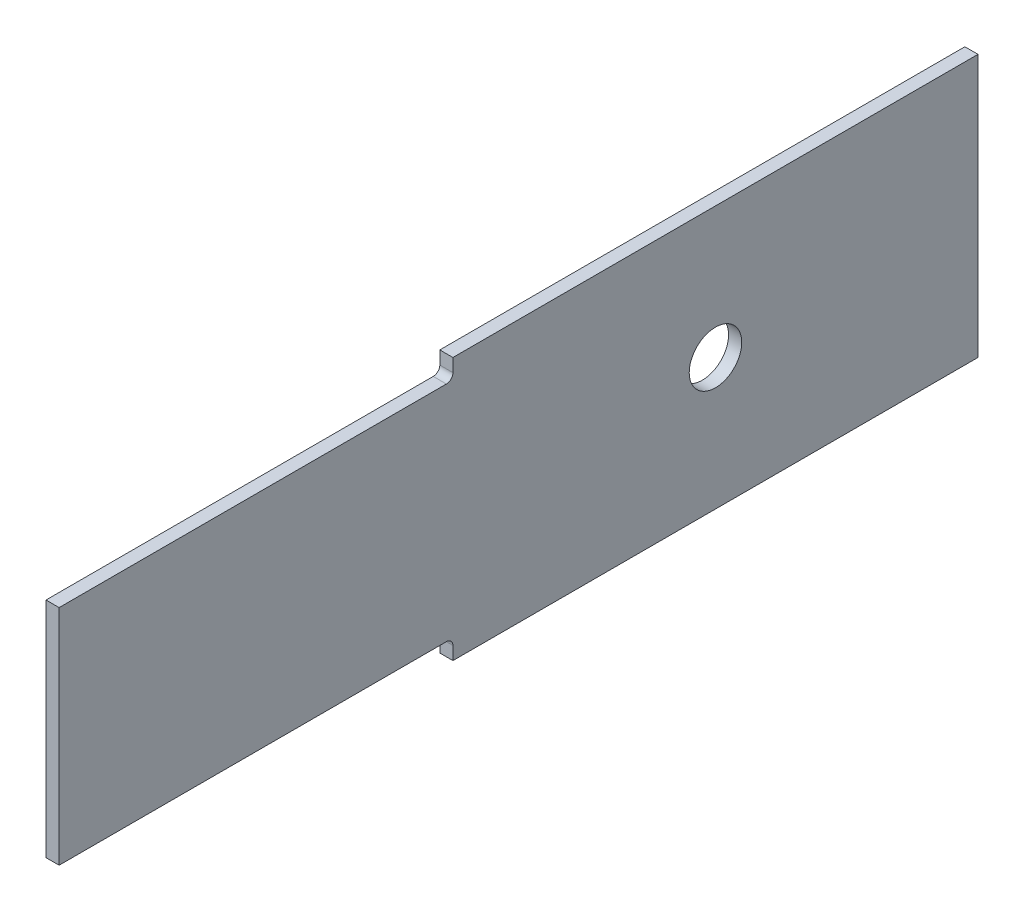
ISO-10303-21;
HEADER;
FILE_DESCRIPTION(('STEP AP214'),'2;1');
FILE_NAME('part.step','',(''),(''),'','','');
FILE_SCHEMA(('AUTOMOTIVE_DESIGN { 1 0 10303 214 1 1 1 1 }'));
ENDSEC;
DATA;
#1=APPLICATION_CONTEXT('core data for automotive mechanical design processes');
#2=APPLICATION_PROTOCOL_DEFINITION('international standard','automotive_design',2000,#1);
#3=PRODUCT_CONTEXT('',#1,'mechanical');
#4=PRODUCT('Part','Part','',(#3));
#5=PRODUCT_RELATED_PRODUCT_CATEGORY('part','',(#4));
#6=PRODUCT_DEFINITION_FORMATION('','',#4);
#7=PRODUCT_DEFINITION_CONTEXT('part definition',#1,'design');
#8=PRODUCT_DEFINITION('design','',#6,#7);
#9=PRODUCT_DEFINITION_SHAPE('','',#8);
#10=(LENGTH_UNIT() NAMED_UNIT(*) SI_UNIT(.MILLI.,.METRE.));
#11=(NAMED_UNIT(*) PLANE_ANGLE_UNIT() SI_UNIT($,.RADIAN.));
#12=(NAMED_UNIT(*) SI_UNIT($,.STERADIAN.) SOLID_ANGLE_UNIT());
#13=UNCERTAINTY_MEASURE_WITH_UNIT(LENGTH_MEASURE(1.E-05),#10,'distance_accuracy_value','');
#14=(GEOMETRIC_REPRESENTATION_CONTEXT(3) GLOBAL_UNCERTAINTY_ASSIGNED_CONTEXT((#13)) GLOBAL_UNIT_ASSIGNED_CONTEXT((#10,
#11,#12)) REPRESENTATION_CONTEXT('',''));
#15=CARTESIAN_POINT('',(0.,0.,0.));
#16=DIRECTION('',(0.,0.,1.));
#17=DIRECTION('',(1.,0.,0.));
#18=AXIS2_PLACEMENT_3D('',#15,#16,#17);
#19=CARTESIAN_POINT('',(0.,0.,80.));
#20=DIRECTION('',(0.,0.,-1.));
#21=DIRECTION('',(-1.,0.,0.));
#22=AXIS2_PLACEMENT_3D('',#19,#20,#21);
#23=PLANE('',#22);
#24=DIRECTION('',(0.,1.,0.));
#25=VECTOR('',#24,1.);
#26=CARTESIAN_POINT('',(1.,-20.,80.));
#27=LINE('',#26,#25);
#28=CARTESIAN_POINT('',(1.,-20.,80.));
#29=VERTEX_POINT('',#28);
#30=CARTESIAN_POINT('',(1.,-18.,80.));
#31=VERTEX_POINT('',#30);
#32=EDGE_CURVE('E150',#29,#31,#27,.T.);
#33=ORIENTED_EDGE('',*,*,#32,.T.);
#34=DIRECTION('',(1.,0.,0.));
#35=VECTOR('',#34,1.);
#36=CARTESIAN_POINT('',(-1.,-18.,80.));
#37=LINE('',#36,#35);
#38=CARTESIAN_POINT('',(-1.,-18.,80.));
#39=VERTEX_POINT('',#38);
#40=EDGE_CURVE('E181',#31,#39,#37,.F.);
#41=ORIENTED_EDGE('',*,*,#40,.T.);
#42=DIRECTION('',(0.,-1.,0.));
#43=VECTOR('',#42,1.);
#44=CARTESIAN_POINT('',(-1.,-20.,80.));
#45=LINE('',#44,#43);
#46=CARTESIAN_POINT('',(-1.,-20.,80.));
#47=VERTEX_POINT('',#46);
#48=EDGE_CURVE('E156',#39,#47,#45,.T.);
#49=ORIENTED_EDGE('',*,*,#48,.T.);
#50=DIRECTION('',(1.,0.,0.));
#51=VECTOR('',#50,1.);
#52=CARTESIAN_POINT('',(-1.,-20.,80.));
#53=LINE('',#52,#51);
#54=EDGE_CURVE('E159',#47,#29,#53,.T.);
#55=ORIENTED_EDGE('',*,*,#54,.T.);
#56=EDGE_LOOP('',(#33,#41,#49,#55));
#57=FACE_BOUND('',#56,.T.);
#58=ADVANCED_FACE('F41',(#57),#23,.F.);
#59=CARTESIAN_POINT('',(-1.,20.,80.));
#60=VERTEX_POINT('',#59);
#61=CARTESIAN_POINT('',(-1.,18.,80.));
#62=VERTEX_POINT('',#61);
#63=EDGE_CURVE('E157',#60,#62,#45,.T.);
#64=ORIENTED_EDGE('',*,*,#63,.T.);
#65=DIRECTION('',(-1.,0.,0.));
#66=VECTOR('',#65,1.);
#67=CARTESIAN_POINT('',(1.,18.,80.));
#68=LINE('',#67,#66);
#69=CARTESIAN_POINT('',(1.,18.,80.));
#70=VERTEX_POINT('',#69);
#71=EDGE_CURVE('E62',#62,#70,#68,.F.);
#72=ORIENTED_EDGE('',*,*,#71,.T.);
#73=CARTESIAN_POINT('',(1.,20.,80.));
#74=VERTEX_POINT('',#73);
#75=EDGE_CURVE('E154',#70,#74,#27,.T.);
#76=ORIENTED_EDGE('',*,*,#75,.T.);
#77=DIRECTION('',(-1.,0.,0.));
#78=VECTOR('',#77,1.);
#79=CARTESIAN_POINT('',(-1.,20.,80.));
#80=LINE('',#79,#78);
#81=EDGE_CURVE('E153',#74,#60,#80,.T.);
#82=ORIENTED_EDGE('',*,*,#81,.T.);
#83=EDGE_LOOP('',(#64,#72,#76,#82));
#84=FACE_BOUND('',#83,.T.);
#85=ADVANCED_FACE('F245',(#84),#23,.F.);
#86=CARTESIAN_POINT('',(1.,-20.,80.));
#87=DIRECTION('',(-1.,0.,0.));
#88=DIRECTION('',(0.,0.,1.));
#89=AXIS2_PLACEMENT_3D('',#86,#87,#88);
#90=PLANE('',#89);
#91=CARTESIAN_POINT('',(1.,0.,40.));
#92=DIRECTION('',(-1.,0.,0.));
#93=DIRECTION('',(0.,0.,1.));
#94=AXIS2_PLACEMENT_3D('',#91,#92,#93);
#95=CIRCLE('',#94,4.);
#96=CARTESIAN_POINT('',(1.,0.,44.));
#97=VERTEX_POINT('',#96);
#98=EDGE_CURVE('E137',#97,#97,#95,.T.);
#99=ORIENTED_EDGE('',*,*,#98,.T.);
#100=EDGE_LOOP('',(#99));
#101=FACE_BOUND('',#100,.T.);
#102=DIRECTION('',(0.,1.,0.));
#103=VECTOR('',#102,1.);
#104=CARTESIAN_POINT('',(1.,-20.,0.));
#105=LINE('',#104,#103);
#106=CARTESIAN_POINT('',(1.,-20.,0.));
#107=VERTEX_POINT('',#106);
#108=CARTESIAN_POINT('',(1.,20.,0.));
#109=VERTEX_POINT('',#108);
#110=EDGE_CURVE('E142',#107,#109,#105,.T.);
#111=ORIENTED_EDGE('',*,*,#110,.T.);
#112=DIRECTION('',(0.,0.,-1.));
#113=VECTOR('',#112,1.);
#114=CARTESIAN_POINT('',(1.,20.,80.));
#115=LINE('',#114,#113);
#116=EDGE_CURVE('E175',#74,#109,#115,.T.);
#117=ORIENTED_EDGE('',*,*,#116,.F.);
#118=ORIENTED_EDGE('',*,*,#75,.F.);
#119=CARTESIAN_POINT('',(1.,18.,81.));
#120=DIRECTION('',(-1.,0.,0.));
#121=DIRECTION('',(0.,0.,1.));
#122=AXIS2_PLACEMENT_3D('',#119,#120,#121);
#123=CIRCLE('',#122,1.);
#124=CARTESIAN_POINT('',(1.,17.,81.));
#125=VERTEX_POINT('',#124);
#126=EDGE_CURVE('E11',#70,#125,#123,.T.);
#127=ORIENTED_EDGE('',*,*,#126,.T.);
#128=DIRECTION('',(0.,0.,-1.));
#129=VECTOR('',#128,1.);
#130=CARTESIAN_POINT('',(1.,17.,140.));
#131=LINE('',#130,#129);
#132=CARTESIAN_POINT('',(1.,17.,140.));
#133=VERTEX_POINT('',#132);
#134=EDGE_CURVE('E122',#133,#125,#131,.T.);
#135=ORIENTED_EDGE('',*,*,#134,.F.);
#136=DIRECTION('',(0.,1.,0.));
#137=VECTOR('',#136,1.);
#138=CARTESIAN_POINT('',(1.,-17.,140.));
#139=LINE('',#138,#137);
#140=CARTESIAN_POINT('',(1.,-17.,140.));
#141=VERTEX_POINT('',#140);
#142=EDGE_CURVE('E128',#141,#133,#139,.T.);
#143=ORIENTED_EDGE('',*,*,#142,.F.);
#144=DIRECTION('',(0.,0.,-1.));
#145=VECTOR('',#144,1.);
#146=CARTESIAN_POINT('',(1.,-17.,140.));
#147=LINE('',#146,#145);
#148=CARTESIAN_POINT('',(1.,-17.,81.));
#149=VERTEX_POINT('',#148);
#150=EDGE_CURVE('E200',#141,#149,#147,.T.);
#151=ORIENTED_EDGE('',*,*,#150,.T.);
#152=CARTESIAN_POINT('',(1.,-18.,81.));
#153=DIRECTION('',(-1.,0.,0.));
#154=DIRECTION('',(0.,0.,1.));
#155=AXIS2_PLACEMENT_3D('',#152,#153,#154);
#156=CIRCLE('',#155,1.);
#157=EDGE_CURVE('E186',#149,#31,#156,.T.);
#158=ORIENTED_EDGE('',*,*,#157,.T.);
#159=ORIENTED_EDGE('',*,*,#32,.F.);
#160=DIRECTION('',(0.,0.,-1.));
#161=VECTOR('',#160,1.);
#162=CARTESIAN_POINT('',(1.,-20.,80.));
#163=LINE('',#162,#161);
#164=EDGE_CURVE('E160',#29,#107,#163,.T.);
#165=ORIENTED_EDGE('',*,*,#164,.T.);
#166=EDGE_LOOP('',(#111,#117,#118,#127,#135,#143,#151,#158,#159,#165));
#167=FACE_BOUND('',#166,.T.);
#168=ADVANCED_FACE('F140',(#101,#167),#90,.F.);
#169=CARTESIAN_POINT('',(-1.,20.,80.));
#170=DIRECTION('',(0.,-1.,0.));
#171=DIRECTION('',(0.,0.,-1.));
#172=AXIS2_PLACEMENT_3D('',#169,#170,#171);
#173=PLANE('',#172);
#174=DIRECTION('',(-1.,0.,0.));
#175=VECTOR('',#174,1.);
#176=CARTESIAN_POINT('',(-1.,20.,0.));
#177=LINE('',#176,#175);
#178=CARTESIAN_POINT('',(-1.,20.,0.));
#179=VERTEX_POINT('',#178);
#180=EDGE_CURVE('E144',#109,#179,#177,.T.);
#181=ORIENTED_EDGE('',*,*,#180,.T.);
#182=DIRECTION('',(0.,0.,-1.));
#183=VECTOR('',#182,1.);
#184=CARTESIAN_POINT('',(-1.,20.,80.));
#185=LINE('',#184,#183);
#186=EDGE_CURVE('E172',#60,#179,#185,.T.);
#187=ORIENTED_EDGE('',*,*,#186,.F.);
#188=ORIENTED_EDGE('',*,*,#81,.F.);
#189=ORIENTED_EDGE('',*,*,#116,.T.);
#190=EDGE_LOOP('',(#181,#187,#188,#189));
#191=FACE_BOUND('',#190,.T.);
#192=ADVANCED_FACE('F217',(#191),#173,.F.);
#193=CARTESIAN_POINT('',(-1.,-20.,80.));
#194=DIRECTION('',(1.,0.,0.));
#195=DIRECTION('',(0.,0.,-1.));
#196=AXIS2_PLACEMENT_3D('',#193,#194,#195);
#197=PLANE('',#196);
#198=CARTESIAN_POINT('',(-1.,0.,40.));
#199=DIRECTION('',(-1.,0.,0.));
#200=DIRECTION('',(0.,0.,1.));
#201=AXIS2_PLACEMENT_3D('',#198,#199,#200);
#202=CIRCLE('',#201,4.);
#203=CARTESIAN_POINT('',(-1.,0.,44.));
#204=VERTEX_POINT('',#203);
#205=EDGE_CURVE('E223',#204,#204,#202,.T.);
#206=ORIENTED_EDGE('',*,*,#205,.F.);
#207=EDGE_LOOP('',(#206));
#208=FACE_BOUND('',#207,.T.);
#209=DIRECTION('',(0.,-1.,0.));
#210=VECTOR('',#209,1.);
#211=CARTESIAN_POINT('',(-1.,-20.,0.));
#212=LINE('',#211,#210);
#213=CARTESIAN_POINT('',(-1.,-20.,0.));
#214=VERTEX_POINT('',#213);
#215=EDGE_CURVE('E163',#179,#214,#212,.T.);
#216=ORIENTED_EDGE('',*,*,#215,.T.);
#217=DIRECTION('',(0.,0.,-1.));
#218=VECTOR('',#217,1.);
#219=CARTESIAN_POINT('',(-1.,-20.,80.));
#220=LINE('',#219,#218);
#221=EDGE_CURVE('E169',#47,#214,#220,.T.);
#222=ORIENTED_EDGE('',*,*,#221,.F.);
#223=ORIENTED_EDGE('',*,*,#48,.F.);
#224=CARTESIAN_POINT('',(-1.,-18.,81.));
#225=DIRECTION('',(1.,0.,0.));
#226=DIRECTION('',(0.,0.,-1.));
#227=AXIS2_PLACEMENT_3D('',#224,#225,#226);
#228=CIRCLE('',#227,1.);
#229=CARTESIAN_POINT('',(-1.,-17.,81.));
#230=VERTEX_POINT('',#229);
#231=EDGE_CURVE('E188',#39,#230,#228,.T.);
#232=ORIENTED_EDGE('',*,*,#231,.T.);
#233=DIRECTION('',(0.,0.,-1.));
#234=VECTOR('',#233,1.);
#235=CARTESIAN_POINT('',(-1.,-17.,140.));
#236=LINE('',#235,#234);
#237=CARTESIAN_POINT('',(-1.,-17.,140.));
#238=VERTEX_POINT('',#237);
#239=EDGE_CURVE('E146',#238,#230,#236,.T.);
#240=ORIENTED_EDGE('',*,*,#239,.F.);
#241=DIRECTION('',(0.,-1.,0.));
#242=VECTOR('',#241,1.);
#243=CARTESIAN_POINT('',(-1.,-17.,140.));
#244=LINE('',#243,#242);
#245=CARTESIAN_POINT('',(-1.,17.,140.));
#246=VERTEX_POINT('',#245);
#247=EDGE_CURVE('E127',#246,#238,#244,.T.);
#248=ORIENTED_EDGE('',*,*,#247,.F.);
#249=DIRECTION('',(0.,0.,-1.));
#250=VECTOR('',#249,1.);
#251=CARTESIAN_POINT('',(-1.,17.,140.));
#252=LINE('',#251,#250);
#253=CARTESIAN_POINT('',(-1.,17.,81.));
#254=VERTEX_POINT('',#253);
#255=EDGE_CURVE('E124',#246,#254,#252,.T.);
#256=ORIENTED_EDGE('',*,*,#255,.T.);
#257=CARTESIAN_POINT('',(-1.,18.,81.));
#258=DIRECTION('',(1.,0.,0.));
#259=DIRECTION('',(0.,0.,-1.));
#260=AXIS2_PLACEMENT_3D('',#257,#258,#259);
#261=CIRCLE('',#260,1.);
#262=EDGE_CURVE('E49',#254,#62,#261,.T.);
#263=ORIENTED_EDGE('',*,*,#262,.T.);
#264=ORIENTED_EDGE('',*,*,#63,.F.);
#265=ORIENTED_EDGE('',*,*,#186,.T.);
#266=EDGE_LOOP('',(#216,#222,#223,#232,#240,#248,#256,#263,#264,#265));
#267=FACE_BOUND('',#266,.T.);
#268=ADVANCED_FACE('F193',(#208,#267),#197,.F.);
#269=CARTESIAN_POINT('',(-1.,-20.,80.));
#270=DIRECTION('',(0.,1.,0.));
#271=DIRECTION('',(0.,0.,1.));
#272=AXIS2_PLACEMENT_3D('',#269,#270,#271);
#273=PLANE('',#272);
#274=DIRECTION('',(1.,0.,0.));
#275=VECTOR('',#274,1.);
#276=CARTESIAN_POINT('',(-1.,-20.,0.));
#277=LINE('',#276,#275);
#278=EDGE_CURVE('E165',#214,#107,#277,.T.);
#279=ORIENTED_EDGE('',*,*,#278,.T.);
#280=ORIENTED_EDGE('',*,*,#164,.F.);
#281=ORIENTED_EDGE('',*,*,#54,.F.);
#282=ORIENTED_EDGE('',*,*,#221,.T.);
#283=EDGE_LOOP('',(#279,#280,#281,#282));
#284=FACE_BOUND('',#283,.T.);
#285=ADVANCED_FACE('F207',(#284),#273,.F.);
#286=CARTESIAN_POINT('',(0.,0.,0.));
#287=DIRECTION('',(0.,0.,-1.));
#288=DIRECTION('',(-1.,0.,0.));
#289=AXIS2_PLACEMENT_3D('',#286,#287,#288);
#290=PLANE('',#289);
#291=ORIENTED_EDGE('',*,*,#110,.F.);
#292=ORIENTED_EDGE('',*,*,#278,.F.);
#293=ORIENTED_EDGE('',*,*,#215,.F.);
#294=ORIENTED_EDGE('',*,*,#180,.F.);
#295=EDGE_LOOP('',(#291,#292,#293,#294));
#296=FACE_BOUND('',#295,.T.);
#297=ADVANCED_FACE('F212',(#296),#290,.T.);
#298=CARTESIAN_POINT('',(-1.,17.,140.));
#299=DIRECTION('',(0.,-1.,0.));
#300=DIRECTION('',(0.,0.,-1.));
#301=AXIS2_PLACEMENT_3D('',#298,#299,#300);
#302=PLANE('',#301);
#303=ORIENTED_EDGE('',*,*,#134,.T.);
#304=DIRECTION('',(-1.,0.,0.));
#305=VECTOR('',#304,1.);
#306=CARTESIAN_POINT('',(-1.,17.,81.));
#307=LINE('',#306,#305);
#308=EDGE_CURVE('E183',#125,#254,#307,.T.);
#309=ORIENTED_EDGE('',*,*,#308,.T.);
#310=ORIENTED_EDGE('',*,*,#255,.F.);
#311=DIRECTION('',(-1.,0.,0.));
#312=VECTOR('',#311,1.);
#313=CARTESIAN_POINT('',(-1.,17.,140.));
#314=LINE('',#313,#312);
#315=EDGE_CURVE('E117',#133,#246,#314,.T.);
#316=ORIENTED_EDGE('',*,*,#315,.F.);
#317=EDGE_LOOP('',(#303,#309,#310,#316));
#318=FACE_BOUND('',#317,.T.);
#319=ADVANCED_FACE('F119',(#318),#302,.F.);
#320=CARTESIAN_POINT('',(-1.,-17.,140.));
#321=DIRECTION('',(0.,1.,0.));
#322=DIRECTION('',(0.,0.,1.));
#323=AXIS2_PLACEMENT_3D('',#320,#321,#322);
#324=PLANE('',#323);
#325=ORIENTED_EDGE('',*,*,#239,.T.);
#326=DIRECTION('',(1.,0.,0.));
#327=VECTOR('',#326,1.);
#328=CARTESIAN_POINT('',(1.,-17.,81.));
#329=LINE('',#328,#327);
#330=EDGE_CURVE('E178',#230,#149,#329,.T.);
#331=ORIENTED_EDGE('',*,*,#330,.T.);
#332=ORIENTED_EDGE('',*,*,#150,.F.);
#333=DIRECTION('',(1.,0.,0.));
#334=VECTOR('',#333,1.);
#335=CARTESIAN_POINT('',(-1.,-17.,140.));
#336=LINE('',#335,#334);
#337=EDGE_CURVE('E133',#238,#141,#336,.T.);
#338=ORIENTED_EDGE('',*,*,#337,.F.);
#339=EDGE_LOOP('',(#325,#331,#332,#338));
#340=FACE_BOUND('',#339,.T.);
#341=ADVANCED_FACE('F199',(#340),#324,.F.);
#342=CARTESIAN_POINT('',(0.,0.,140.));
#343=DIRECTION('',(0.,0.,-1.));
#344=DIRECTION('',(-1.,0.,0.));
#345=AXIS2_PLACEMENT_3D('',#342,#343,#344);
#346=PLANE('',#345);
#347=ORIENTED_EDGE('',*,*,#142,.T.);
#348=ORIENTED_EDGE('',*,*,#315,.T.);
#349=ORIENTED_EDGE('',*,*,#247,.T.);
#350=ORIENTED_EDGE('',*,*,#337,.T.);
#351=EDGE_LOOP('',(#347,#348,#349,#350));
#352=FACE_BOUND('',#351,.T.);
#353=ADVANCED_FACE('F131',(#352),#346,.F.);
#354=CARTESIAN_POINT('',(-1.,-18.,81.));
#355=DIRECTION('',(-1.,0.,0.));
#356=DIRECTION('',(0.,0.,1.));
#357=AXIS2_PLACEMENT_3D('',#354,#355,#356);
#358=CYLINDRICAL_SURFACE('',#357,1.);
#359=ORIENTED_EDGE('',*,*,#231,.F.);
#360=ORIENTED_EDGE('',*,*,#40,.F.);
#361=ORIENTED_EDGE('',*,*,#157,.F.);
#362=ORIENTED_EDGE('',*,*,#330,.F.);
#363=EDGE_LOOP('',(#359,#360,#361,#362));
#364=FACE_BOUND('',#363,.T.);
#365=ADVANCED_FACE('F201',(#364),#358,.F.);
#366=CARTESIAN_POINT('',(-1.,18.,81.));
#367=DIRECTION('',(1.,0.,0.));
#368=DIRECTION('',(0.,0.,-1.));
#369=AXIS2_PLACEMENT_3D('',#366,#367,#368);
#370=CYLINDRICAL_SURFACE('',#369,1.);
#371=ORIENTED_EDGE('',*,*,#126,.F.);
#372=ORIENTED_EDGE('',*,*,#71,.F.);
#373=ORIENTED_EDGE('',*,*,#262,.F.);
#374=ORIENTED_EDGE('',*,*,#308,.F.);
#375=EDGE_LOOP('',(#371,#372,#373,#374));
#376=FACE_BOUND('',#375,.T.);
#377=ADVANCED_FACE('F43',(#376),#370,.F.);
#378=CARTESIAN_POINT('',(1.,0.,40.));
#379=DIRECTION('',(-1.,0.,0.));
#380=DIRECTION('',(0.,0.,1.));
#381=AXIS2_PLACEMENT_3D('',#378,#379,#380);
#382=CYLINDRICAL_SURFACE('',#381,4.);
#383=ORIENTED_EDGE('',*,*,#98,.F.);
#384=EDGE_LOOP('',(#383));
#385=FACE_BOUND('',#384,.T.);
#386=ORIENTED_EDGE('',*,*,#205,.T.);
#387=EDGE_LOOP('',(#386));
#388=FACE_BOUND('',#387,.T.);
#389=ADVANCED_FACE('F230',(#385,#388),#382,.F.);
#390=CLOSED_SHELL('',(#58,#85,#168,#192,#268,#285,#297,#319,#341,#353,#365,#377,#389));
#391=MANIFOLD_SOLID_BREP('B2',#390);
#392=ADVANCED_BREP_SHAPE_REPRESENTATION('',(#18,#391),#14);
#393=SHAPE_DEFINITION_REPRESENTATION(#9,#392);
ENDSEC;
END-ISO-10303-21;
